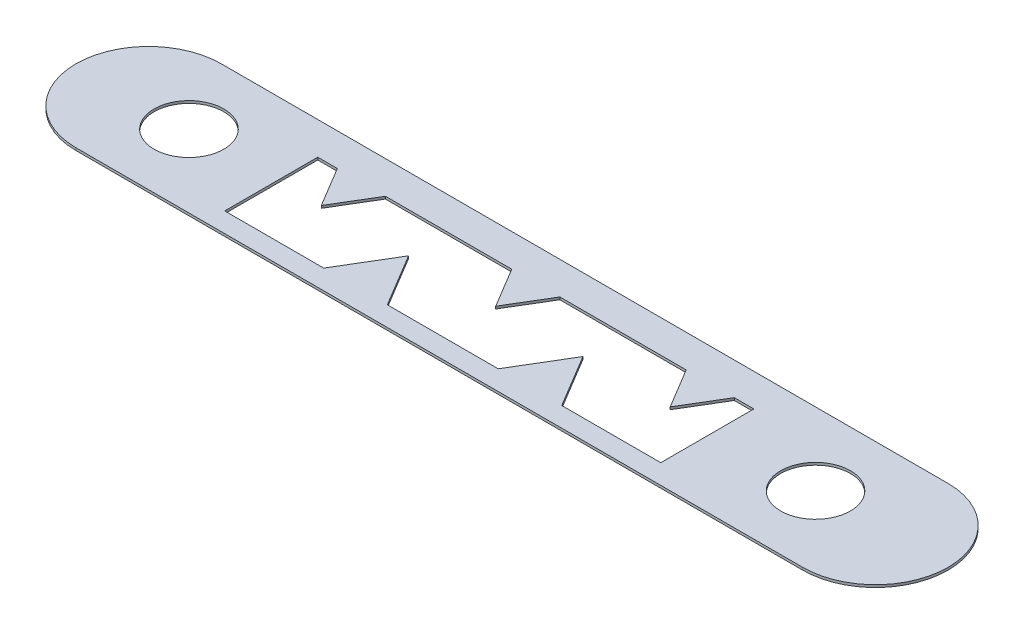
ISO-10303-21;
HEADER;
FILE_DESCRIPTION(('STEP AP214'),'2;1');
FILE_NAME('part.step','',(''),(''),'','','');
FILE_SCHEMA(('AUTOMOTIVE_DESIGN { 1 0 10303 214 1 1 1 1 }'));
ENDSEC;
DATA;
#1=APPLICATION_CONTEXT('core data for automotive mechanical design processes');
#2=APPLICATION_PROTOCOL_DEFINITION('international standard','automotive_design',2000,#1);
#3=PRODUCT_CONTEXT('',#1,'mechanical');
#4=PRODUCT('Part','Part','',(#3));
#5=PRODUCT_RELATED_PRODUCT_CATEGORY('part','',(#4));
#6=PRODUCT_DEFINITION_FORMATION('','',#4);
#7=PRODUCT_DEFINITION_CONTEXT('part definition',#1,'design');
#8=PRODUCT_DEFINITION('design','',#6,#7);
#9=PRODUCT_DEFINITION_SHAPE('','',#8);
#10=(LENGTH_UNIT() NAMED_UNIT(*) SI_UNIT(.MILLI.,.METRE.));
#11=(NAMED_UNIT(*) PLANE_ANGLE_UNIT() SI_UNIT($,.RADIAN.));
#12=(NAMED_UNIT(*) SI_UNIT($,.STERADIAN.) SOLID_ANGLE_UNIT());
#13=UNCERTAINTY_MEASURE_WITH_UNIT(LENGTH_MEASURE(1.E-05),#10,'distance_accuracy_value','');
#14=(GEOMETRIC_REPRESENTATION_CONTEXT(3) GLOBAL_UNCERTAINTY_ASSIGNED_CONTEXT((#13)) GLOBAL_UNIT_ASSIGNED_CONTEXT((#10,
#11,#12)) REPRESENTATION_CONTEXT('',''));
#15=CARTESIAN_POINT('',(0.,0.,0.));
#16=DIRECTION('',(0.,0.,1.));
#17=DIRECTION('',(1.,0.,0.));
#18=AXIS2_PLACEMENT_3D('',#15,#16,#17);
#19=CARTESIAN_POINT('',(61.6827451121535,0.85,37.0096470672921));
#20=DIRECTION('',(-0.857492925712544,0.,-0.514495755427526));
#21=DIRECTION('',(-0.514495755427526,0.,0.857492925712544));
#22=AXIS2_PLACEMENT_3D('',#19,#20,#21);
#23=PLANE('',#22);
#24=DIRECTION('',(0.514495755427526,0.,-0.857492925712544));
#25=VECTOR('',#24,1.);
#26=CARTESIAN_POINT('',(61.6827451121535,0.,37.0096470672921));
#27=LINE('',#26,#25);
#28=CARTESIAN_POINT('',(94.8260333525287,0.,-18.2291666666667));
#29=VERTEX_POINT('',#28);
#30=CARTESIAN_POINT('',(103.091739333466,0.,-32.005343301562));
#31=VERTEX_POINT('',#30);
#32=EDGE_CURVE('E251',#29,#31,#27,.T.);
#33=ORIENTED_EDGE('',*,*,#32,.T.);
#34=DIRECTION('',(0.,-1.,0.));
#35=VECTOR('',#34,1.);
#36=CARTESIAN_POINT('',(103.091739333466,0.85,-32.005343301562));
#37=LINE('',#36,#35);
#38=CARTESIAN_POINT('',(103.091739333466,0.85,-32.005343301562));
#39=VERTEX_POINT('',#38);
#40=EDGE_CURVE('E11',#39,#31,#37,.T.);
#41=ORIENTED_EDGE('',*,*,#40,.F.);
#42=DIRECTION('',(0.514495755427526,0.,-0.857492925712544));
#43=VECTOR('',#42,1.);
#44=CARTESIAN_POINT('',(61.6827451121535,0.85,37.0096470672921));
#45=LINE('',#44,#43);
#46=CARTESIAN_POINT('',(94.8260333525287,0.85,-18.2291666666667));
#47=VERTEX_POINT('',#46);
#48=EDGE_CURVE('E489',#47,#39,#45,.T.);
#49=ORIENTED_EDGE('',*,*,#48,.F.);
#50=DIRECTION('',(0.,-1.,0.));
#51=VECTOR('',#50,1.);
#52=CARTESIAN_POINT('',(94.8260333525287,0.85,-18.2291666666667));
#53=LINE('',#52,#51);
#54=EDGE_CURVE('E302',#47,#29,#53,.T.);
#55=ORIENTED_EDGE('',*,*,#54,.T.);
#56=EDGE_LOOP('',(#33,#41,#49,#55));
#57=FACE_BOUND('',#56,.T.);
#58=ADVANCED_FACE('F36',(#57),#23,.F.);
#59=CARTESIAN_POINT('',(0.,0.85,-32.005343301562));
#60=DIRECTION('',(0.,0.,-1.));
#61=DIRECTION('',(-1.,0.,0.));
#62=AXIS2_PLACEMENT_3D('',#59,#60,#61);
#63=PLANE('',#62);
#64=DIRECTION('',(1.,0.,0.));
#65=VECTOR('',#64,1.);
#66=CARTESIAN_POINT('',(0.,0.,-32.005343301562));
#67=LINE('',#66,#65);
#68=CARTESIAN_POINT('',(146.560327371592,0.,-32.005343301562));
#69=VERTEX_POINT('',#68);
#70=EDGE_CURVE('E258',#31,#69,#67,.T.);
#71=ORIENTED_EDGE('',*,*,#70,.T.);
#72=DIRECTION('',(0.,-1.,0.));
#73=VECTOR('',#72,1.);
#74=CARTESIAN_POINT('',(146.560327371592,0.85,-32.005343301562));
#75=LINE('',#74,#73);
#76=CARTESIAN_POINT('',(146.560327371592,0.85,-32.005343301562));
#77=VERTEX_POINT('',#76);
#78=EDGE_CURVE('E48',#77,#69,#75,.T.);
#79=ORIENTED_EDGE('',*,*,#78,.F.);
#80=DIRECTION('',(1.,0.,0.));
#81=VECTOR('',#80,1.);
#82=CARTESIAN_POINT('',(0.,0.85,-32.005343301562));
#83=LINE('',#82,#81);
#84=EDGE_CURVE('E219',#39,#77,#83,.T.);
#85=ORIENTED_EDGE('',*,*,#84,.F.);
#86=ORIENTED_EDGE('',*,*,#40,.T.);
#87=EDGE_LOOP('',(#71,#79,#85,#86));
#88=FACE_BOUND('',#87,.T.);
#89=ADVANCED_FACE('F367',(#88),#63,.F.);
#90=CARTESIAN_POINT('',(121.884950994506,0.85,-73.1309705967039));
#91=DIRECTION('',(0.857492925712544,0.,-0.514495755427527));
#92=DIRECTION('',(-0.514495755427527,0.,-0.857492925712544));
#93=AXIS2_PLACEMENT_3D('',#90,#91,#92);
#94=PLANE('',#93);
#95=DIRECTION('',(0.514495755427527,0.,0.857492925712544));
#96=VECTOR('',#95,1.);
#97=CARTESIAN_POINT('',(121.884950994506,0.,-73.1309705967039));
#98=LINE('',#97,#96);
#99=CARTESIAN_POINT('',(154.826033352529,0.,-18.2291666666667));
#100=VERTEX_POINT('',#99);
#101=EDGE_CURVE('E256',#69,#100,#98,.T.);
#102=ORIENTED_EDGE('',*,*,#101,.T.);
#103=DIRECTION('',(0.,-1.,0.));
#104=VECTOR('',#103,1.);
#105=CARTESIAN_POINT('',(154.826033352529,0.85,-18.2291666666667));
#106=LINE('',#105,#104);
#107=CARTESIAN_POINT('',(154.826033352529,0.85,-18.2291666666667));
#108=VERTEX_POINT('',#107);
#109=EDGE_CURVE('E332',#108,#100,#106,.T.);
#110=ORIENTED_EDGE('',*,*,#109,.F.);
#111=DIRECTION('',(0.514495755427527,0.,0.857492925712544));
#112=VECTOR('',#111,1.);
#113=CARTESIAN_POINT('',(121.884950994506,0.85,-73.1309705967039));
#114=LINE('',#113,#112);
#115=EDGE_CURVE('E495',#77,#108,#114,.T.);
#116=ORIENTED_EDGE('',*,*,#115,.F.);
#117=ORIENTED_EDGE('',*,*,#78,.T.);
#118=EDGE_LOOP('',(#102,#110,#116,#117));
#119=FACE_BOUND('',#118,.T.);
#120=ADVANCED_FACE('F376',(#119),#94,.F.);
#121=CARTESIAN_POINT('',(105.800392170977,0.85,63.4802353025862));
#122=DIRECTION('',(0.857492925712544,0.,0.514495755427526));
#123=DIRECTION('',(0.514495755427526,0.,-0.857492925712544));
#124=AXIS2_PLACEMENT_3D('',#121,#122,#123);
#125=PLANE('',#124);
#126=DIRECTION('',(-0.514495755427526,0.,0.857492925712544));
#127=VECTOR('',#126,1.);
#128=CARTESIAN_POINT('',(105.800392170977,0.,63.4802353025862));
#129=LINE('',#128,#127);
#130=CARTESIAN_POINT('',(163.091739333466,0.,-32.005343301562));
#131=VERTEX_POINT('',#130);
#132=EDGE_CURVE('E265',#131,#100,#129,.T.);
#133=ORIENTED_EDGE('',*,*,#132,.F.);
#134=DIRECTION('',(0.,-1.,0.));
#135=VECTOR('',#134,1.);
#136=CARTESIAN_POINT('',(163.091739333466,0.85,-32.005343301562));
#137=LINE('',#136,#135);
#138=CARTESIAN_POINT('',(163.091739333466,0.85,-32.005343301562));
#139=VERTEX_POINT('',#138);
#140=EDGE_CURVE('E328',#139,#131,#137,.T.);
#141=ORIENTED_EDGE('',*,*,#140,.F.);
#142=DIRECTION('',(-0.514495755427526,0.,0.857492925712544));
#143=VECTOR('',#142,1.);
#144=CARTESIAN_POINT('',(105.800392170977,0.85,63.4802353025862));
#145=LINE('',#144,#143);
#146=EDGE_CURVE('E496',#139,#108,#145,.T.);
#147=ORIENTED_EDGE('',*,*,#146,.T.);
#148=ORIENTED_EDGE('',*,*,#109,.T.);
#149=EDGE_LOOP('',(#133,#141,#147,#148));
#150=FACE_BOUND('',#149,.T.);
#151=ADVANCED_FACE('F431',(#150),#125,.T.);
#152=CARTESIAN_POINT('',(206.560327371591,0.,-32.005343301562));
#153=VERTEX_POINT('',#152);
#154=EDGE_CURVE('E259',#131,#153,#67,.T.);
#155=ORIENTED_EDGE('',*,*,#154,.T.);
#156=DIRECTION('',(0.,-1.,0.));
#157=VECTOR('',#156,1.);
#158=CARTESIAN_POINT('',(206.560327371591,0.85,-32.005343301562));
#159=LINE('',#158,#157);
#160=CARTESIAN_POINT('',(206.560327371591,0.85,-32.005343301562));
#161=VERTEX_POINT('',#160);
#162=EDGE_CURVE('E326',#161,#153,#159,.T.);
#163=ORIENTED_EDGE('',*,*,#162,.F.);
#164=EDGE_CURVE('E492',#139,#161,#83,.T.);
#165=ORIENTED_EDGE('',*,*,#164,.F.);
#166=ORIENTED_EDGE('',*,*,#140,.T.);
#167=EDGE_LOOP('',(#155,#163,#165,#166));
#168=FACE_BOUND('',#167,.T.);
#169=ADVANCED_FACE('F377',(#168),#63,.F.);
#170=CARTESIAN_POINT('',(166.00259805333,0.85,-99.6015588319979));
#171=DIRECTION('',(0.857492925712545,0.,-0.514495755427526));
#172=DIRECTION('',(-0.514495755427526,0.,-0.857492925712545));
#173=AXIS2_PLACEMENT_3D('',#170,#171,#172);
#174=PLANE('',#173);
#175=DIRECTION('',(0.514495755427526,0.,0.857492925712545));
#176=VECTOR('',#175,1.);
#177=CARTESIAN_POINT('',(166.00259805333,0.,-99.6015588319979));
#178=LINE('',#177,#176);
#179=CARTESIAN_POINT('',(214.826033352529,0.,-18.2291666666667));
#180=VERTEX_POINT('',#179);
#181=EDGE_CURVE('E264',#153,#180,#178,.T.);
#182=ORIENTED_EDGE('',*,*,#181,.T.);
#183=DIRECTION('',(0.,-1.,0.));
#184=VECTOR('',#183,1.);
#185=CARTESIAN_POINT('',(214.826033352529,0.85,-18.2291666666667));
#186=LINE('',#185,#184);
#187=CARTESIAN_POINT('',(214.826033352529,0.85,-18.2291666666667));
#188=VERTEX_POINT('',#187);
#189=EDGE_CURVE('E322',#188,#180,#186,.T.);
#190=ORIENTED_EDGE('',*,*,#189,.F.);
#191=DIRECTION('',(0.514495755427526,0.,0.857492925712545));
#192=VECTOR('',#191,1.);
#193=CARTESIAN_POINT('',(166.00259805333,0.85,-99.6015588319979));
#194=LINE('',#193,#192);
#195=EDGE_CURVE('E501',#161,#188,#194,.T.);
#196=ORIENTED_EDGE('',*,*,#195,.F.);
#197=ORIENTED_EDGE('',*,*,#162,.T.);
#198=EDGE_LOOP('',(#182,#190,#196,#197));
#199=FACE_BOUND('',#198,.T.);
#200=ADVANCED_FACE('F430',(#199),#174,.F.);
#201=CARTESIAN_POINT('',(149.9180392298,0.85,89.9508235378804));
#202=DIRECTION('',(0.857492925712544,0.,0.514495755427527));
#203=DIRECTION('',(0.514495755427527,0.,-0.857492925712544));
#204=AXIS2_PLACEMENT_3D('',#201,#202,#203);
#205=PLANE('',#204);
#206=DIRECTION('',(-0.514495755427527,0.,0.857492925712544));
#207=VECTOR('',#206,1.);
#208=CARTESIAN_POINT('',(149.9180392298,0.,89.9508235378804));
#209=LINE('',#208,#207);
#210=CARTESIAN_POINT('',(223.091739333466,0.,-32.0053433015621));
#211=VERTEX_POINT('',#210);
#212=EDGE_CURVE('E268',#211,#180,#209,.T.);
#213=ORIENTED_EDGE('',*,*,#212,.F.);
#214=DIRECTION('',(0.,-1.,0.));
#215=VECTOR('',#214,1.);
#216=CARTESIAN_POINT('',(223.091739333466,0.85,-32.0053433015621));
#217=LINE('',#216,#215);
#218=CARTESIAN_POINT('',(223.091739333466,0.85,-32.0053433015621));
#219=VERTEX_POINT('',#218);
#220=EDGE_CURVE('E325',#219,#211,#217,.T.);
#221=ORIENTED_EDGE('',*,*,#220,.F.);
#222=DIRECTION('',(-0.514495755427527,0.,0.857492925712544));
#223=VECTOR('',#222,1.);
#224=CARTESIAN_POINT('',(149.9180392298,0.85,89.9508235378804));
#225=LINE('',#224,#223);
#226=EDGE_CURVE('E502',#219,#188,#225,.T.);
#227=ORIENTED_EDGE('',*,*,#226,.T.);
#228=ORIENTED_EDGE('',*,*,#189,.T.);
#229=EDGE_LOOP('',(#213,#221,#227,#228));
#230=FACE_BOUND('',#229,.T.);
#231=ADVANCED_FACE('F424',(#230),#205,.T.);
#232=CARTESIAN_POINT('',(229.826033352529,0.,-32.005343301562));
#233=VERTEX_POINT('',#232);
#234=EDGE_CURVE('E271',#211,#233,#67,.T.);
#235=ORIENTED_EDGE('',*,*,#234,.T.);
#236=DIRECTION('',(0.,-1.,0.));
#237=VECTOR('',#236,1.);
#238=CARTESIAN_POINT('',(229.826033352529,0.85,-32.005343301562));
#239=LINE('',#238,#237);
#240=CARTESIAN_POINT('',(229.826033352529,0.85,-32.005343301562));
#241=VERTEX_POINT('',#240);
#242=EDGE_CURVE('E317',#241,#233,#239,.T.);
#243=ORIENTED_EDGE('',*,*,#242,.F.);
#244=EDGE_CURVE('E218',#219,#241,#83,.T.);
#245=ORIENTED_EDGE('',*,*,#244,.F.);
#246=ORIENTED_EDGE('',*,*,#220,.T.);
#247=EDGE_LOOP('',(#235,#243,#245,#246));
#248=FACE_BOUND('',#247,.T.);
#249=ADVANCED_FACE('F394',(#248),#63,.F.);
#250=CARTESIAN_POINT('',(229.826033352529,0.85,0.));
#251=DIRECTION('',(1.,0.,0.));
#252=DIRECTION('',(0.,0.,-1.));
#253=AXIS2_PLACEMENT_3D('',#250,#251,#252);
#254=PLANE('',#253);
#255=DIRECTION('',(0.,0.,1.));
#256=VECTOR('',#255,1.);
#257=CARTESIAN_POINT('',(229.826033352529,0.,0.));
#258=LINE('',#257,#256);
#259=CARTESIAN_POINT('',(229.826033352529,0.,0.));
#260=VERTEX_POINT('',#259);
#261=EDGE_CURVE('E275',#233,#260,#258,.T.);
#262=ORIENTED_EDGE('',*,*,#261,.T.);
#263=DIRECTION('',(0.,-1.,0.));
#264=VECTOR('',#263,1.);
#265=CARTESIAN_POINT('',(229.826033352529,0.85,0.));
#266=LINE('',#265,#264);
#267=CARTESIAN_POINT('',(229.826033352529,0.85,0.));
#268=VERTEX_POINT('',#267);
#269=EDGE_CURVE('E320',#268,#260,#266,.T.);
#270=ORIENTED_EDGE('',*,*,#269,.F.);
#271=DIRECTION('',(0.,0.,1.));
#272=VECTOR('',#271,1.);
#273=CARTESIAN_POINT('',(229.826033352529,0.85,0.));
#274=LINE('',#273,#272);
#275=EDGE_CURVE('E456',#241,#268,#274,.T.);
#276=ORIENTED_EDGE('',*,*,#275,.F.);
#277=ORIENTED_EDGE('',*,*,#242,.T.);
#278=EDGE_LOOP('',(#262,#270,#276,#277));
#279=FACE_BOUND('',#278,.T.);
#280=ADVANCED_FACE('F419',(#279),#254,.F.);
#281=CARTESIAN_POINT('',(0.,0.85,0.));
#282=DIRECTION('',(0.,0.,-1.));
#283=DIRECTION('',(-1.,0.,0.));
#284=AXIS2_PLACEMENT_3D('',#281,#282,#283);
#285=PLANE('',#284);
#286=DIRECTION('',(1.,0.,0.));
#287=VECTOR('',#286,1.);
#288=CARTESIAN_POINT('',(0.,0.,0.));
#289=LINE('',#288,#287);
#290=CARTESIAN_POINT('',(195.763533352529,0.,0.));
#291=VERTEX_POINT('',#290);
#292=EDGE_CURVE('E274',#291,#260,#289,.T.);
#293=ORIENTED_EDGE('',*,*,#292,.F.);
#294=DIRECTION('',(0.,-1.,0.));
#295=VECTOR('',#294,1.);
#296=CARTESIAN_POINT('',(195.763533352529,0.85,0.));
#297=LINE('',#296,#295);
#298=CARTESIAN_POINT('',(195.763533352529,0.85,0.));
#299=VERTEX_POINT('',#298);
#300=EDGE_CURVE('E312',#299,#291,#297,.T.);
#301=ORIENTED_EDGE('',*,*,#300,.F.);
#302=DIRECTION('',(1.,0.,0.));
#303=VECTOR('',#302,1.);
#304=CARTESIAN_POINT('',(0.,0.85,0.));
#305=LINE('',#304,#303);
#306=EDGE_CURVE('E229',#299,#268,#305,.T.);
#307=ORIENTED_EDGE('',*,*,#306,.T.);
#308=ORIENTED_EDGE('',*,*,#269,.T.);
#309=EDGE_LOOP('',(#293,#301,#307,#308));
#310=FACE_BOUND('',#309,.T.);
#311=ADVANCED_FACE('F401',(#310),#285,.T.);
#312=CARTESIAN_POINT('',(143.943774523918,0.85,-86.3662647143509));
#313=DIRECTION('',(0.857492925712544,0.,-0.514495755427526));
#314=DIRECTION('',(-0.514495755427526,0.,-0.857492925712544));
#315=AXIS2_PLACEMENT_3D('',#312,#313,#314);
#316=PLANE('',#315);
#317=DIRECTION('',(0.514495755427526,0.,0.857492925712544));
#318=VECTOR('',#317,1.);
#319=CARTESIAN_POINT('',(143.943774523918,0.,-86.3662647143509));
#320=LINE('',#319,#318);
#321=CARTESIAN_POINT('',(184.826033352529,0.,-18.2291666666667));
#322=VERTEX_POINT('',#321);
#323=EDGE_CURVE('E279',#322,#291,#320,.T.);
#324=ORIENTED_EDGE('',*,*,#323,.F.);
#325=DIRECTION('',(0.,-1.,0.));
#326=VECTOR('',#325,1.);
#327=CARTESIAN_POINT('',(184.826033352529,0.85,-18.2291666666667));
#328=LINE('',#327,#326);
#329=CARTESIAN_POINT('',(184.826033352529,0.85,-18.2291666666667));
#330=VERTEX_POINT('',#329);
#331=EDGE_CURVE('E311',#330,#322,#328,.T.);
#332=ORIENTED_EDGE('',*,*,#331,.F.);
#333=DIRECTION('',(0.514495755427526,0.,0.857492925712544));
#334=VECTOR('',#333,1.);
#335=CARTESIAN_POINT('',(143.943774523918,0.85,-86.3662647143509));
#336=LINE('',#335,#334);
#337=EDGE_CURVE('E470',#330,#299,#336,.T.);
#338=ORIENTED_EDGE('',*,*,#337,.T.);
#339=ORIENTED_EDGE('',*,*,#300,.T.);
#340=EDGE_LOOP('',(#324,#332,#338,#339));
#341=FACE_BOUND('',#340,.T.);
#342=ADVANCED_FACE('F413',(#341),#316,.T.);
#343=CARTESIAN_POINT('',(127.859215700389,0.85,76.7155294202332));
#344=DIRECTION('',(0.857492925712544,0.,0.514495755427526));
#345=DIRECTION('',(0.514495755427526,0.,-0.857492925712544));
#346=AXIS2_PLACEMENT_3D('',#343,#344,#345);
#347=PLANE('',#346);
#348=DIRECTION('',(-0.514495755427526,0.,0.857492925712544));
#349=VECTOR('',#348,1.);
#350=CARTESIAN_POINT('',(127.859215700389,0.,76.7155294202332));
#351=LINE('',#350,#349);
#352=CARTESIAN_POINT('',(173.888533352529,0.,0.));
#353=VERTEX_POINT('',#352);
#354=EDGE_CURVE('E282',#322,#353,#351,.T.);
#355=ORIENTED_EDGE('',*,*,#354,.T.);
#356=DIRECTION('',(0.,-1.,0.));
#357=VECTOR('',#356,1.);
#358=CARTESIAN_POINT('',(173.888533352529,0.85,0.));
#359=LINE('',#358,#357);
#360=CARTESIAN_POINT('',(173.888533352529,0.85,0.));
#361=VERTEX_POINT('',#360);
#362=EDGE_CURVE('E313',#361,#353,#359,.T.);
#363=ORIENTED_EDGE('',*,*,#362,.F.);
#364=DIRECTION('',(-0.514495755427526,0.,0.857492925712544));
#365=VECTOR('',#364,1.);
#366=CARTESIAN_POINT('',(127.859215700389,0.85,76.7155294202332));
#367=LINE('',#366,#365);
#368=EDGE_CURVE('E469',#330,#361,#367,.T.);
#369=ORIENTED_EDGE('',*,*,#368,.F.);
#370=ORIENTED_EDGE('',*,*,#331,.T.);
#371=EDGE_LOOP('',(#355,#363,#369,#370));
#372=FACE_BOUND('',#371,.T.);
#373=ADVANCED_FACE('F415',(#372),#347,.F.);
#374=CARTESIAN_POINT('',(135.763533352529,0.,0.));
#375=VERTEX_POINT('',#374);
#376=EDGE_CURVE('E278',#375,#353,#289,.T.);
#377=ORIENTED_EDGE('',*,*,#376,.F.);
#378=DIRECTION('',(0.,-1.,0.));
#379=VECTOR('',#378,1.);
#380=CARTESIAN_POINT('',(135.763533352529,0.85,0.));
#381=LINE('',#380,#379);
#382=CARTESIAN_POINT('',(135.763533352529,0.85,0.));
#383=VERTEX_POINT('',#382);
#384=EDGE_CURVE('E310',#383,#375,#381,.T.);
#385=ORIENTED_EDGE('',*,*,#384,.F.);
#386=EDGE_CURVE('E228',#383,#361,#305,.T.);
#387=ORIENTED_EDGE('',*,*,#386,.T.);
#388=ORIENTED_EDGE('',*,*,#362,.T.);
#389=EDGE_LOOP('',(#377,#385,#387,#388));
#390=FACE_BOUND('',#389,.T.);
#391=ADVANCED_FACE('F404',(#390),#285,.T.);
#392=CARTESIAN_POINT('',(99.8261274650947,0.85,-59.8956764790568));
#393=DIRECTION('',(0.857492925712544,0.,-0.514495755427526));
#394=DIRECTION('',(-0.514495755427526,0.,-0.857492925712544));
#395=AXIS2_PLACEMENT_3D('',#392,#393,#394);
#396=PLANE('',#395);
#397=DIRECTION('',(0.514495755427526,0.,0.857492925712544));
#398=VECTOR('',#397,1.);
#399=CARTESIAN_POINT('',(99.8261274650947,0.,-59.8956764790568));
#400=LINE('',#399,#398);
#401=CARTESIAN_POINT('',(124.826033352529,0.,-18.2291666666667));
#402=VERTEX_POINT('',#401);
#403=EDGE_CURVE('E287',#402,#375,#400,.T.);
#404=ORIENTED_EDGE('',*,*,#403,.F.);
#405=DIRECTION('',(0.,-1.,0.));
#406=VECTOR('',#405,1.);
#407=CARTESIAN_POINT('',(124.826033352529,0.85,-18.2291666666667));
#408=LINE('',#407,#406);
#409=CARTESIAN_POINT('',(124.826033352529,0.85,-18.2291666666667));
#410=VERTEX_POINT('',#409);
#411=EDGE_CURVE('E307',#410,#402,#408,.T.);
#412=ORIENTED_EDGE('',*,*,#411,.F.);
#413=DIRECTION('',(0.514495755427526,0.,0.857492925712544));
#414=VECTOR('',#413,1.);
#415=CARTESIAN_POINT('',(99.8261274650947,0.85,-59.8956764790568));
#416=LINE('',#415,#414);
#417=EDGE_CURVE('E472',#410,#383,#416,.T.);
#418=ORIENTED_EDGE('',*,*,#417,.T.);
#419=ORIENTED_EDGE('',*,*,#384,.T.);
#420=EDGE_LOOP('',(#404,#412,#418,#419));
#421=FACE_BOUND('',#420,.T.);
#422=ADVANCED_FACE('F410',(#421),#396,.T.);
#423=CARTESIAN_POINT('',(83.7415686415653,0.85,50.2449411849391));
#424=DIRECTION('',(0.857492925712545,0.,0.514495755427526));
#425=DIRECTION('',(0.514495755427526,0.,-0.857492925712545));
#426=AXIS2_PLACEMENT_3D('',#423,#424,#425);
#427=PLANE('',#426);
#428=DIRECTION('',(-0.514495755427526,0.,0.857492925712545));
#429=VECTOR('',#428,1.);
#430=CARTESIAN_POINT('',(83.7415686415653,0.,50.2449411849391));
#431=LINE('',#430,#429);
#432=CARTESIAN_POINT('',(113.888533352529,0.,0.));
#433=VERTEX_POINT('',#432);
#434=EDGE_CURVE('E286',#402,#433,#431,.T.);
#435=ORIENTED_EDGE('',*,*,#434,.T.);
#436=DIRECTION('',(0.,-1.,0.));
#437=VECTOR('',#436,1.);
#438=CARTESIAN_POINT('',(113.888533352529,0.85,0.));
#439=LINE('',#438,#437);
#440=CARTESIAN_POINT('',(113.888533352529,0.85,0.));
#441=VERTEX_POINT('',#440);
#442=EDGE_CURVE('E303',#441,#433,#439,.T.);
#443=ORIENTED_EDGE('',*,*,#442,.F.);
#444=DIRECTION('',(-0.514495755427526,0.,0.857492925712545));
#445=VECTOR('',#444,1.);
#446=CARTESIAN_POINT('',(83.7415686415653,0.85,50.2449411849391));
#447=LINE('',#446,#445);
#448=EDGE_CURVE('E230',#410,#441,#447,.T.);
#449=ORIENTED_EDGE('',*,*,#448,.F.);
#450=ORIENTED_EDGE('',*,*,#411,.T.);
#451=EDGE_LOOP('',(#435,#443,#449,#450));
#452=FACE_BOUND('',#451,.T.);
#453=ADVANCED_FACE('F402',(#452),#427,.F.);
#454=CARTESIAN_POINT('',(79.8260333525287,0.,0.));
#455=VERTEX_POINT('',#454);
#456=EDGE_CURVE('E276',#455,#433,#289,.T.);
#457=ORIENTED_EDGE('',*,*,#456,.F.);
#458=DIRECTION('',(0.,-1.,0.));
#459=VECTOR('',#458,1.);
#460=CARTESIAN_POINT('',(79.8260333525287,0.85,0.));
#461=LINE('',#460,#459);
#462=CARTESIAN_POINT('',(79.8260333525287,0.85,0.));
#463=VERTEX_POINT('',#462);
#464=EDGE_CURVE('E213',#463,#455,#461,.T.);
#465=ORIENTED_EDGE('',*,*,#464,.F.);
#466=EDGE_CURVE('E223',#463,#441,#305,.T.);
#467=ORIENTED_EDGE('',*,*,#466,.T.);
#468=ORIENTED_EDGE('',*,*,#442,.T.);
#469=EDGE_LOOP('',(#457,#465,#467,#468));
#470=FACE_BOUND('',#469,.T.);
#471=ADVANCED_FACE('F399',(#470),#285,.T.);
#472=CARTESIAN_POINT('',(79.8260333525287,0.85,0.));
#473=DIRECTION('',(1.,0.,0.));
#474=DIRECTION('',(0.,0.,-1.));
#475=AXIS2_PLACEMENT_3D('',#472,#473,#474);
#476=PLANE('',#475);
#477=DIRECTION('',(0.,0.,1.));
#478=VECTOR('',#477,1.);
#479=CARTESIAN_POINT('',(79.8260333525287,0.,0.));
#480=LINE('',#479,#478);
#481=CARTESIAN_POINT('',(79.8260333525287,0.,-32.005343301562));
#482=VERTEX_POINT('',#481);
#483=EDGE_CURVE('E215',#482,#455,#480,.T.);
#484=ORIENTED_EDGE('',*,*,#483,.F.);
#485=DIRECTION('',(0.,-1.,0.));
#486=VECTOR('',#485,1.);
#487=CARTESIAN_POINT('',(79.8260333525287,0.85,-32.005343301562));
#488=LINE('',#487,#486);
#489=CARTESIAN_POINT('',(79.8260333525287,0.85,-32.005343301562));
#490=VERTEX_POINT('',#489);
#491=EDGE_CURVE('E206',#490,#482,#488,.T.);
#492=ORIENTED_EDGE('',*,*,#491,.F.);
#493=DIRECTION('',(0.,0.,1.));
#494=VECTOR('',#493,1.);
#495=CARTESIAN_POINT('',(79.8260333525287,0.85,0.));
#496=LINE('',#495,#494);
#497=EDGE_CURVE('E209',#490,#463,#496,.T.);
#498=ORIENTED_EDGE('',*,*,#497,.T.);
#499=ORIENTED_EDGE('',*,*,#464,.T.);
#500=EDGE_LOOP('',(#484,#492,#498,#499));
#501=FACE_BOUND('',#500,.T.);
#502=ADVANCED_FACE('F208',(#501),#476,.T.);
#503=CARTESIAN_POINT('',(86.5603273715915,0.,-32.005343301562));
#504=VERTEX_POINT('',#503);
#505=EDGE_CURVE('E128',#482,#504,#67,.T.);
#506=ORIENTED_EDGE('',*,*,#505,.T.);
#507=DIRECTION('',(0.,-1.,0.));
#508=VECTOR('',#507,1.);
#509=CARTESIAN_POINT('',(86.5603273715915,0.85,-32.005343301562));
#510=LINE('',#509,#508);
#511=CARTESIAN_POINT('',(86.5603273715915,0.85,-32.005343301562));
#512=VERTEX_POINT('',#511);
#513=EDGE_CURVE('E212',#512,#504,#510,.T.);
#514=ORIENTED_EDGE('',*,*,#513,.F.);
#515=EDGE_CURVE('E216',#490,#512,#83,.T.);
#516=ORIENTED_EDGE('',*,*,#515,.F.);
#517=ORIENTED_EDGE('',*,*,#491,.T.);
#518=EDGE_LOOP('',(#506,#514,#516,#517));
#519=FACE_BOUND('',#518,.T.);
#520=ADVANCED_FACE('F220',(#519),#63,.F.);
#521=CARTESIAN_POINT('',(35.4166666666666,0.85,-18.2291666666667));
#522=DIRECTION('',(0.,-1.,0.));
#523=DIRECTION('',(0.,0.,-1.));
#524=AXIS2_PLACEMENT_3D('',#521,#522,#523);
#525=CYLINDRICAL_SURFACE('',#524,25.);
#526=CARTESIAN_POINT('',(35.4166666666666,0.,-18.2291666666667));
#527=DIRECTION('',(0.,1.,0.));
#528=DIRECTION('',(0.,0.,1.));
#529=AXIS2_PLACEMENT_3D('',#526,#527,#528);
#530=CIRCLE('',#529,25.);
#531=CARTESIAN_POINT('',(35.4166666666666,0.,-43.2291666666667));
#532=VERTEX_POINT('',#531);
#533=CARTESIAN_POINT('',(35.4166666666666,0.,6.77083333333333));
#534=VERTEX_POINT('',#533);
#535=EDGE_CURVE('E245',#532,#534,#530,.T.);
#536=ORIENTED_EDGE('',*,*,#535,.T.);
#537=DIRECTION('',(0.,-1.,0.));
#538=VECTOR('',#537,1.);
#539=CARTESIAN_POINT('',(35.4166666666666,0.85,6.77083333333333));
#540=LINE('',#539,#538);
#541=CARTESIAN_POINT('',(35.4166666666666,0.85,6.77083333333333));
#542=VERTEX_POINT('',#541);
#543=EDGE_CURVE('E45',#542,#534,#540,.T.);
#544=ORIENTED_EDGE('',*,*,#543,.F.);
#545=CARTESIAN_POINT('',(35.4166666666666,0.85,-18.2291666666667));
#546=DIRECTION('',(0.,1.,0.));
#547=DIRECTION('',(0.,0.,1.));
#548=AXIS2_PLACEMENT_3D('',#545,#546,#547);
#549=CIRCLE('',#548,25.);
#550=CARTESIAN_POINT('',(35.4166666666666,0.85,-43.2291666666667));
#551=VERTEX_POINT('',#550);
#552=EDGE_CURVE('E299',#551,#542,#549,.T.);
#553=ORIENTED_EDGE('',*,*,#552,.F.);
#554=DIRECTION('',(0.,-1.,0.));
#555=VECTOR('',#554,1.);
#556=CARTESIAN_POINT('',(35.4166666666666,0.85,-43.2291666666667));
#557=LINE('',#556,#555);
#558=EDGE_CURVE('E241',#551,#532,#557,.T.);
#559=ORIENTED_EDGE('',*,*,#558,.T.);
#560=EDGE_LOOP('',(#536,#544,#553,#559));
#561=FACE_BOUND('',#560,.T.);
#562=ADVANCED_FACE('F37',(#561),#525,.T.);
#563=CARTESIAN_POINT('',(0.,0.85,6.77083333333333));
#564=DIRECTION('',(0.,0.,-1.));
#565=DIRECTION('',(-1.,0.,0.));
#566=AXIS2_PLACEMENT_3D('',#563,#564,#565);
#567=PLANE('',#566);
#568=DIRECTION('',(1.,0.,0.));
#569=VECTOR('',#568,1.);
#570=CARTESIAN_POINT('',(0.,0.,6.77083333333333));
#571=LINE('',#570,#569);
#572=CARTESIAN_POINT('',(285.416666666667,0.,6.77083333333332));
#573=VERTEX_POINT('',#572);
#574=EDGE_CURVE('E244',#534,#573,#571,.T.);
#575=ORIENTED_EDGE('',*,*,#574,.T.);
#576=DIRECTION('',(0.,-1.,0.));
#577=VECTOR('',#576,1.);
#578=CARTESIAN_POINT('',(285.416666666667,0.85,6.77083333333332));
#579=LINE('',#578,#577);
#580=CARTESIAN_POINT('',(285.416666666667,0.85,6.77083333333332));
#581=VERTEX_POINT('',#580);
#582=EDGE_CURVE('E340',#581,#573,#579,.T.);
#583=ORIENTED_EDGE('',*,*,#582,.F.);
#584=DIRECTION('',(1.,0.,0.));
#585=VECTOR('',#584,1.);
#586=CARTESIAN_POINT('',(0.,0.85,6.77083333333333));
#587=LINE('',#586,#585);
#588=EDGE_CURVE('E144',#542,#581,#587,.T.);
#589=ORIENTED_EDGE('',*,*,#588,.F.);
#590=ORIENTED_EDGE('',*,*,#543,.T.);
#591=EDGE_LOOP('',(#575,#583,#589,#590));
#592=FACE_BOUND('',#591,.T.);
#593=ADVANCED_FACE('F344',(#592),#567,.F.);
#594=CARTESIAN_POINT('',(285.416666666667,0.85,-18.2291666666667));
#595=DIRECTION('',(0.,-1.,0.));
#596=DIRECTION('',(0.,0.,-1.));
#597=AXIS2_PLACEMENT_3D('',#594,#595,#596);
#598=CYLINDRICAL_SURFACE('',#597,25.);
#599=CARTESIAN_POINT('',(285.416666666667,0.,-18.2291666666667));
#600=DIRECTION('',(0.,1.,0.));
#601=DIRECTION('',(0.,0.,1.));
#602=AXIS2_PLACEMENT_3D('',#599,#600,#601);
#603=CIRCLE('',#602,25.);
#604=CARTESIAN_POINT('',(285.416666666667,0.,-43.2291666666667));
#605=VERTEX_POINT('',#604);
#606=EDGE_CURVE('E250',#573,#605,#603,.T.);
#607=ORIENTED_EDGE('',*,*,#606,.T.);
#608=DIRECTION('',(0.,-1.,0.));
#609=VECTOR('',#608,1.);
#610=CARTESIAN_POINT('',(285.416666666667,0.85,-43.2291666666667));
#611=LINE('',#610,#609);
#612=CARTESIAN_POINT('',(285.416666666667,0.85,-43.2291666666667));
#613=VERTEX_POINT('',#612);
#614=EDGE_CURVE('E336',#613,#605,#611,.T.);
#615=ORIENTED_EDGE('',*,*,#614,.F.);
#616=CARTESIAN_POINT('',(285.416666666667,0.85,-18.2291666666667));
#617=DIRECTION('',(0.,1.,0.));
#618=DIRECTION('',(0.,0.,1.));
#619=AXIS2_PLACEMENT_3D('',#616,#617,#618);
#620=CIRCLE('',#619,25.);
#621=EDGE_CURVE('E493',#581,#613,#620,.T.);
#622=ORIENTED_EDGE('',*,*,#621,.F.);
#623=ORIENTED_EDGE('',*,*,#582,.T.);
#624=EDGE_LOOP('',(#607,#615,#622,#623));
#625=FACE_BOUND('',#624,.T.);
#626=ADVANCED_FACE('F360',(#625),#598,.T.);
#627=CARTESIAN_POINT('',(264.825532318065,0.85,-18.2291666666667));
#628=DIRECTION('',(0.,-1.,0.));
#629=DIRECTION('',(0.,0.,-1.));
#630=AXIS2_PLACEMENT_3D('',#627,#628,#629);
#631=CYLINDRICAL_SURFACE('',#630,12.);
#632=CARTESIAN_POINT('',(264.825532318065,0.85,-18.2291666666667));
#633=DIRECTION('',(0.,1.,0.));
#634=DIRECTION('',(0.,0.,1.));
#635=AXIS2_PLACEMENT_3D('',#632,#633,#634);
#636=CIRCLE('',#635,12.);
#637=CARTESIAN_POINT('',(264.825532318065,0.85,-6.22916666666665));
#638=VERTEX_POINT('',#637);
#639=EDGE_CURVE('E233',#638,#638,#636,.T.);
#640=ORIENTED_EDGE('',*,*,#639,.T.);
#641=EDGE_LOOP('',(#640));
#642=FACE_BOUND('',#641,.T.);
#643=CARTESIAN_POINT('',(264.825532318065,0.,-18.2291666666667));
#644=DIRECTION('',(0.,1.,0.));
#645=DIRECTION('',(0.,0.,1.));
#646=AXIS2_PLACEMENT_3D('',#643,#644,#645);
#647=CIRCLE('',#646,12.);
#648=CARTESIAN_POINT('',(264.825532318065,0.,-6.22916666666665));
#649=VERTEX_POINT('',#648);
#650=EDGE_CURVE('E294',#649,#649,#647,.T.);
#651=ORIENTED_EDGE('',*,*,#650,.F.);
#652=EDGE_LOOP('',(#651));
#653=FACE_BOUND('',#652,.T.);
#654=ADVANCED_FACE('F356',(#642,#653),#631,.F.);
#655=CARTESIAN_POINT('',(77.7673039356829,0.85,-46.6603823614097));
#656=DIRECTION('',(0.857492925712544,0.,-0.514495755427526));
#657=DIRECTION('',(-0.514495755427526,0.,-0.857492925712544));
#658=AXIS2_PLACEMENT_3D('',#655,#656,#657);
#659=PLANE('',#658);
#660=DIRECTION('',(0.514495755427526,0.,0.857492925712544));
#661=VECTOR('',#660,1.);
#662=CARTESIAN_POINT('',(77.7673039356829,0.,-46.6603823614097));
#663=LINE('',#662,#661);
#664=EDGE_CURVE('E137',#504,#29,#663,.T.);
#665=ORIENTED_EDGE('',*,*,#664,.T.);
#666=ORIENTED_EDGE('',*,*,#54,.F.);
#667=DIRECTION('',(0.514495755427526,0.,0.857492925712544));
#668=VECTOR('',#667,1.);
#669=CARTESIAN_POINT('',(77.7673039356829,0.85,-46.6603823614097));
#670=LINE('',#669,#668);
#671=EDGE_CURVE('E60',#512,#47,#670,.T.);
#672=ORIENTED_EDGE('',*,*,#671,.F.);
#673=ORIENTED_EDGE('',*,*,#513,.T.);
#674=EDGE_LOOP('',(#665,#666,#672,#673));
#675=FACE_BOUND('',#674,.T.);
#676=ADVANCED_FACE('F364',(#675),#659,.F.);
#677=CARTESIAN_POINT('',(0.,0.85,-43.2291666666667));
#678=DIRECTION('',(0.,0.,-1.));
#679=DIRECTION('',(-1.,0.,0.));
#680=AXIS2_PLACEMENT_3D('',#677,#678,#679);
#681=PLANE('',#680);
#682=DIRECTION('',(1.,0.,0.));
#683=VECTOR('',#682,1.);
#684=CARTESIAN_POINT('',(0.,0.,-43.2291666666667));
#685=LINE('',#684,#683);
#686=EDGE_CURVE('E248',#532,#605,#685,.T.);
#687=ORIENTED_EDGE('',*,*,#686,.F.);
#688=ORIENTED_EDGE('',*,*,#558,.F.);
#689=DIRECTION('',(1.,0.,0.));
#690=VECTOR('',#689,1.);
#691=CARTESIAN_POINT('',(0.,0.85,-43.2291666666667));
#692=LINE('',#691,#690);
#693=EDGE_CURVE('E357',#551,#613,#692,.T.);
#694=ORIENTED_EDGE('',*,*,#693,.T.);
#695=ORIENTED_EDGE('',*,*,#614,.T.);
#696=EDGE_LOOP('',(#687,#688,#694,#695));
#697=FACE_BOUND('',#696,.T.);
#698=ADVANCED_FACE('F355',(#697),#681,.T.);
#699=CARTESIAN_POINT('',(49.2974109288875,0.85,-18.2291666666667));
#700=DIRECTION('',(0.,-1.,0.));
#701=DIRECTION('',(0.,0.,-1.));
#702=AXIS2_PLACEMENT_3D('',#699,#700,#701);
#703=CYLINDRICAL_SURFACE('',#702,12.);
#704=CARTESIAN_POINT('',(49.2974109288875,0.85,-18.2291666666667));
#705=DIRECTION('',(0.,1.,0.));
#706=DIRECTION('',(0.,0.,1.));
#707=AXIS2_PLACEMENT_3D('',#704,#705,#706);
#708=CIRCLE('',#707,12.);
#709=CARTESIAN_POINT('',(49.2974109288875,0.85,-6.22916666666668));
#710=VERTEX_POINT('',#709);
#711=EDGE_CURVE('E236',#710,#710,#708,.T.);
#712=ORIENTED_EDGE('',*,*,#711,.T.);
#713=EDGE_LOOP('',(#712));
#714=FACE_BOUND('',#713,.T.);
#715=CARTESIAN_POINT('',(49.2974109288875,0.,-18.2291666666667));
#716=DIRECTION('',(0.,1.,0.));
#717=DIRECTION('',(0.,0.,1.));
#718=AXIS2_PLACEMENT_3D('',#715,#716,#717);
#719=CIRCLE('',#718,12.);
#720=CARTESIAN_POINT('',(49.2974109288875,0.,-6.22916666666668));
#721=VERTEX_POINT('',#720);
#722=EDGE_CURVE('E300',#721,#721,#719,.T.);
#723=ORIENTED_EDGE('',*,*,#722,.F.);
#724=EDGE_LOOP('',(#723));
#725=FACE_BOUND('',#724,.T.);
#726=ADVANCED_FACE('F382',(#714,#725),#703,.F.);
#727=CARTESIAN_POINT('',(0.,0.85,0.));
#728=DIRECTION('',(0.,1.,0.));
#729=DIRECTION('',(0.,0.,1.));
#730=AXIS2_PLACEMENT_3D('',#727,#728,#729);
#731=PLANE('',#730);
#732=ORIENTED_EDGE('',*,*,#552,.T.);
#733=ORIENTED_EDGE('',*,*,#588,.T.);
#734=ORIENTED_EDGE('',*,*,#621,.T.);
#735=ORIENTED_EDGE('',*,*,#693,.F.);
#736=EDGE_LOOP('',(#732,#733,#734,#735));
#737=FACE_BOUND('',#736,.T.);
#738=ORIENTED_EDGE('',*,*,#48,.T.);
#739=ORIENTED_EDGE('',*,*,#84,.T.);
#740=ORIENTED_EDGE('',*,*,#115,.T.);
#741=ORIENTED_EDGE('',*,*,#146,.F.);
#742=ORIENTED_EDGE('',*,*,#164,.T.);
#743=ORIENTED_EDGE('',*,*,#195,.T.);
#744=ORIENTED_EDGE('',*,*,#226,.F.);
#745=ORIENTED_EDGE('',*,*,#244,.T.);
#746=ORIENTED_EDGE('',*,*,#275,.T.);
#747=ORIENTED_EDGE('',*,*,#306,.F.);
#748=ORIENTED_EDGE('',*,*,#337,.F.);
#749=ORIENTED_EDGE('',*,*,#368,.T.);
#750=ORIENTED_EDGE('',*,*,#386,.F.);
#751=ORIENTED_EDGE('',*,*,#417,.F.);
#752=ORIENTED_EDGE('',*,*,#448,.T.);
#753=ORIENTED_EDGE('',*,*,#466,.F.);
#754=ORIENTED_EDGE('',*,*,#497,.F.);
#755=ORIENTED_EDGE('',*,*,#515,.T.);
#756=ORIENTED_EDGE('',*,*,#671,.T.);
#757=EDGE_LOOP('',(#738,#739,#740,#741,#742,#743,#744,#745,#746,#747,#748,#749,#750,#751,#752,
#753,#754,#755,#756));
#758=FACE_BOUND('',#757,.T.);
#759=ORIENTED_EDGE('',*,*,#639,.F.);
#760=EDGE_LOOP('',(#759));
#761=FACE_BOUND('',#760,.T.);
#762=ORIENTED_EDGE('',*,*,#711,.F.);
#763=EDGE_LOOP('',(#762));
#764=FACE_BOUND('',#763,.T.);
#765=ADVANCED_FACE('F225',(#737,#758,#761,#764),#731,.T.);
#766=CARTESIAN_POINT('',(0.,0.,0.));
#767=DIRECTION('',(0.,1.,0.));
#768=DIRECTION('',(0.,0.,1.));
#769=AXIS2_PLACEMENT_3D('',#766,#767,#768);
#770=PLANE('',#769);
#771=ORIENTED_EDGE('',*,*,#535,.F.);
#772=ORIENTED_EDGE('',*,*,#686,.T.);
#773=ORIENTED_EDGE('',*,*,#606,.F.);
#774=ORIENTED_EDGE('',*,*,#574,.F.);
#775=EDGE_LOOP('',(#771,#772,#773,#774));
#776=FACE_BOUND('',#775,.T.);
#777=ORIENTED_EDGE('',*,*,#32,.F.);
#778=ORIENTED_EDGE('',*,*,#664,.F.);
#779=ORIENTED_EDGE('',*,*,#505,.F.);
#780=ORIENTED_EDGE('',*,*,#483,.T.);
#781=ORIENTED_EDGE('',*,*,#456,.T.);
#782=ORIENTED_EDGE('',*,*,#434,.F.);
#783=ORIENTED_EDGE('',*,*,#403,.T.);
#784=ORIENTED_EDGE('',*,*,#376,.T.);
#785=ORIENTED_EDGE('',*,*,#354,.F.);
#786=ORIENTED_EDGE('',*,*,#323,.T.);
#787=ORIENTED_EDGE('',*,*,#292,.T.);
#788=ORIENTED_EDGE('',*,*,#261,.F.);
#789=ORIENTED_EDGE('',*,*,#234,.F.);
#790=ORIENTED_EDGE('',*,*,#212,.T.);
#791=ORIENTED_EDGE('',*,*,#181,.F.);
#792=ORIENTED_EDGE('',*,*,#154,.F.);
#793=ORIENTED_EDGE('',*,*,#132,.T.);
#794=ORIENTED_EDGE('',*,*,#101,.F.);
#795=ORIENTED_EDGE('',*,*,#70,.F.);
#796=EDGE_LOOP('',(#777,#778,#779,#780,#781,#782,#783,#784,#785,#786,#787,#788,#789,#790,#791,
#792,#793,#794,#795));
#797=FACE_BOUND('',#796,.T.);
#798=ORIENTED_EDGE('',*,*,#650,.T.);
#799=EDGE_LOOP('',(#798));
#800=FACE_BOUND('',#799,.T.);
#801=ORIENTED_EDGE('',*,*,#722,.T.);
#802=EDGE_LOOP('',(#801));
#803=FACE_BOUND('',#802,.T.);
#804=ADVANCED_FACE('F349',(#776,#797,#800,#803),#770,.F.);
#805=CLOSED_SHELL('',(#58,#89,#120,#151,#169,#200,#231,#249,#280,#311,#342,#373,#391,#422,#453,
#471,#502,#520,#562,#593,#626,#654,#676,#698,#726,#765,#804));
#806=MANIFOLD_SOLID_BREP('B2',#805);
#807=ADVANCED_BREP_SHAPE_REPRESENTATION('',(#18,#806),#14);
#808=SHAPE_DEFINITION_REPRESENTATION(#9,#807);
ENDSEC;
END-ISO-10303-21;
